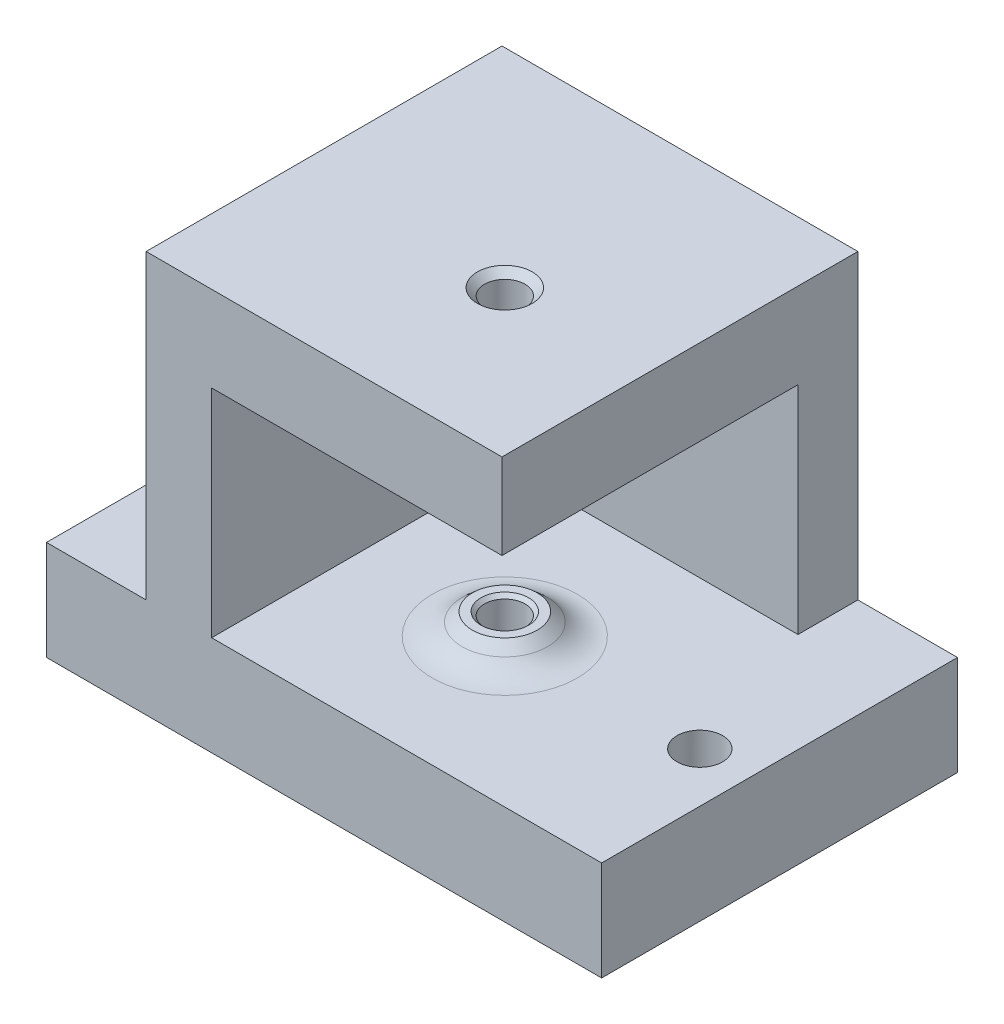
ISO-10303-21;
HEADER;
FILE_DESCRIPTION(('STEP AP214'),'2;1');
FILE_NAME('part.step','',(''),(''),'','','');
FILE_SCHEMA(('AUTOMOTIVE_DESIGN { 1 0 10303 214 1 1 1 1 }'));
ENDSEC;
DATA;
#1=APPLICATION_CONTEXT('core data for automotive mechanical design processes');
#2=APPLICATION_PROTOCOL_DEFINITION('international standard','automotive_design',2000,#1);
#3=PRODUCT_CONTEXT('',#1,'mechanical');
#4=PRODUCT('Part','Part','',(#3));
#5=PRODUCT_RELATED_PRODUCT_CATEGORY('part','',(#4));
#6=PRODUCT_DEFINITION_FORMATION('','',#4);
#7=PRODUCT_DEFINITION_CONTEXT('part definition',#1,'design');
#8=PRODUCT_DEFINITION('design','',#6,#7);
#9=PRODUCT_DEFINITION_SHAPE('','',#8);
#10=(LENGTH_UNIT() NAMED_UNIT(*) SI_UNIT(.MILLI.,.METRE.));
#11=(NAMED_UNIT(*) PLANE_ANGLE_UNIT() SI_UNIT($,.RADIAN.));
#12=(NAMED_UNIT(*) SI_UNIT($,.STERADIAN.) SOLID_ANGLE_UNIT());
#13=UNCERTAINTY_MEASURE_WITH_UNIT(LENGTH_MEASURE(1.E-05),#10,'distance_accuracy_value','');
#14=(GEOMETRIC_REPRESENTATION_CONTEXT(3) GLOBAL_UNCERTAINTY_ASSIGNED_CONTEXT((#13)) GLOBAL_UNIT_ASSIGNED_CONTEXT((#10,
#11,#12)) REPRESENTATION_CONTEXT('',''));
#15=CARTESIAN_POINT('',(0.,0.,0.));
#16=DIRECTION('',(0.,0.,1.));
#17=DIRECTION('',(1.,0.,0.));
#18=AXIS2_PLACEMENT_3D('',#15,#16,#17);
#19=CARTESIAN_POINT('',(0.,22.2,0.));
#20=DIRECTION('',(0.,1.,0.));
#21=DIRECTION('',(0.,0.,1.));
#22=AXIS2_PLACEMENT_3D('',#19,#20,#21);
#23=PLANE('',#22);
#24=CARTESIAN_POINT('',(2.30115930793886,22.2,2.10435385617415));
#25=DIRECTION('',(0.,1.,0.));
#26=DIRECTION('',(0.,0.,1.));
#27=AXIS2_PLACEMENT_3D('',#24,#25,#26);
#28=CIRCLE('',#27,5.09807621135332);
#29=CARTESIAN_POINT('',(2.30115930793886,22.2,7.20243006752747));
#30=VERTEX_POINT('',#29);
#31=EDGE_CURVE('E271',#30,#30,#28,.T.);
#32=ORIENTED_EDGE('',*,*,#31,.T.);
#33=EDGE_LOOP('',(#32));
#34=FACE_BOUND('',#33,.T.);
#35=DIRECTION('',(1.,0.,0.));
#36=VECTOR('',#35,1.);
#37=CARTESIAN_POINT('',(-12.5,22.2,12.5));
#38=LINE('',#37,#36);
#39=CARTESIAN_POINT('',(-7.89768138412228,22.2,12.5));
#40=VERTEX_POINT('',#39);
#41=CARTESIAN_POINT('',(12.5,22.2,12.5));
#42=VERTEX_POINT('',#41);
#43=EDGE_CURVE('E173',#40,#42,#38,.T.);
#44=ORIENTED_EDGE('',*,*,#43,.F.);
#45=DIRECTION('',(0.,0.,-1.));
#46=VECTOR('',#45,1.);
#47=CARTESIAN_POINT('',(-7.89768138412228,22.2,12.5));
#48=LINE('',#47,#46);
#49=CARTESIAN_POINT('',(-7.89768138412228,22.2,-8.29129228765169));
#50=VERTEX_POINT('',#49);
#51=EDGE_CURVE('E230',#40,#50,#48,.T.);
#52=ORIENTED_EDGE('',*,*,#51,.T.);
#53=DIRECTION('',(1.,0.,0.));
#54=VECTOR('',#53,1.);
#55=CARTESIAN_POINT('',(-7.89768138412228,22.2,-8.29129228765169));
#56=LINE('',#55,#54);
#57=CARTESIAN_POINT('',(12.5,22.2,-8.29129228765169));
#58=VERTEX_POINT('',#57);
#59=EDGE_CURVE('E234',#50,#58,#56,.T.);
#60=ORIENTED_EDGE('',*,*,#59,.T.);
#61=DIRECTION('',(0.,0.,-1.));
#62=VECTOR('',#61,1.);
#63=CARTESIAN_POINT('',(12.5,22.2,12.5));
#64=LINE('',#63,#62);
#65=EDGE_CURVE('E210',#42,#58,#64,.T.);
#66=ORIENTED_EDGE('',*,*,#65,.F.);
#67=EDGE_LOOP('',(#44,#52,#60,#66));
#68=FACE_BOUND('',#67,.T.);
#69=ADVANCED_FACE('F47',(#34,#68),#23,.F.);
#70=CARTESIAN_POINT('',(0.,7.,0.));
#71=DIRECTION('',(0.,-1.,0.));
#72=DIRECTION('',(0.,0.,-1.));
#73=AXIS2_PLACEMENT_3D('',#70,#71,#72);
#74=PLANE('',#73);
#75=CARTESIAN_POINT('',(2.30115930793886,7.,2.10435385617415));
#76=DIRECTION('',(0.,-1.,0.));
#77=DIRECTION('',(0.,0.,-1.));
#78=AXIS2_PLACEMENT_3D('',#75,#76,#77);
#79=CIRCLE('',#78,5.09807621135332);
#80=CARTESIAN_POINT('',(2.30115930793886,7.,-2.99372235517916));
#81=VERTEX_POINT('',#80);
#82=EDGE_CURVE('E275',#81,#81,#79,.T.);
#83=ORIENTED_EDGE('',*,*,#82,.T.);
#84=EDGE_LOOP('',(#83));
#85=FACE_BOUND('',#84,.T.);
#86=DIRECTION('',(1.,0.,0.));
#87=VECTOR('',#86,1.);
#88=CARTESIAN_POINT('',(-7.89768138412228,7.,-8.29129228765169));
#89=LINE('',#88,#87);
#90=CARTESIAN_POINT('',(-7.89768138412228,7.,-8.29129228765169));
#91=VERTEX_POINT('',#90);
#92=CARTESIAN_POINT('',(12.5,7.,-8.29129228765169));
#93=VERTEX_POINT('',#92);
#94=EDGE_CURVE('E235',#91,#93,#89,.T.);
#95=ORIENTED_EDGE('',*,*,#94,.F.);
#96=DIRECTION('',(0.,0.,-1.));
#97=VECTOR('',#96,1.);
#98=CARTESIAN_POINT('',(-7.89768138412228,7.,12.5));
#99=LINE('',#98,#97);
#100=CARTESIAN_POINT('',(-7.89768138412228,7.,12.5));
#101=VERTEX_POINT('',#100);
#102=EDGE_CURVE('E138',#101,#91,#99,.T.);
#103=ORIENTED_EDGE('',*,*,#102,.F.);
#104=DIRECTION('',(1.,0.,0.));
#105=VECTOR('',#104,1.);
#106=CARTESIAN_POINT('',(-12.5,7.,12.5));
#107=LINE('',#106,#105);
#108=CARTESIAN_POINT('',(19.5,7.,12.5));
#109=VERTEX_POINT('',#108);
#110=EDGE_CURVE('E130',#101,#109,#107,.T.);
#111=ORIENTED_EDGE('',*,*,#110,.T.);
#112=DIRECTION('',(0.,0.,1.));
#113=VECTOR('',#112,1.);
#114=CARTESIAN_POINT('',(19.5,7.,-12.5));
#115=LINE('',#114,#113);
#116=CARTESIAN_POINT('',(19.5,7.,-12.5));
#117=VERTEX_POINT('',#116);
#118=EDGE_CURVE('E135',#117,#109,#115,.T.);
#119=ORIENTED_EDGE('',*,*,#118,.F.);
#120=DIRECTION('',(1.,0.,0.));
#121=VECTOR('',#120,1.);
#122=CARTESIAN_POINT('',(12.5,7.,-12.5));
#123=LINE('',#122,#121);
#124=CARTESIAN_POINT('',(12.5,7.,-12.5));
#125=VERTEX_POINT('',#124);
#126=EDGE_CURVE('E65',#125,#117,#123,.T.);
#127=ORIENTED_EDGE('',*,*,#126,.F.);
#128=DIRECTION('',(0.,0.,-1.));
#129=VECTOR('',#128,1.);
#130=CARTESIAN_POINT('',(12.5,7.,12.5));
#131=LINE('',#130,#129);
#132=EDGE_CURVE('E11',#93,#125,#131,.T.);
#133=ORIENTED_EDGE('',*,*,#132,.F.);
#134=EDGE_LOOP('',(#95,#103,#111,#119,#127,#133));
#135=FACE_BOUND('',#134,.T.);
#136=CARTESIAN_POINT('',(16.,7.,2.10435385617415));
#137=DIRECTION('',(0.,-1.,0.));
#138=DIRECTION('',(0.,0.,-1.));
#139=AXIS2_PLACEMENT_3D('',#136,#137,#138);
#140=CIRCLE('',#139,1.60000000000001);
#141=CARTESIAN_POINT('',(16.,7.,0.504353856174149));
#142=VERTEX_POINT('',#141);
#143=EDGE_CURVE('E169',#142,#142,#140,.T.);
#144=ORIENTED_EDGE('',*,*,#143,.T.);
#145=EDGE_LOOP('',(#144));
#146=FACE_BOUND('',#145,.T.);
#147=ADVANCED_FACE('F132',(#85,#135,#146),#74,.F.);
#148=CARTESIAN_POINT('',(12.5,7.,12.5));
#149=DIRECTION('',(-1.,0.,0.));
#150=DIRECTION('',(0.,0.,1.));
#151=AXIS2_PLACEMENT_3D('',#148,#149,#150);
#152=PLANE('',#151);
#153=DIRECTION('',(0.,-1.,0.));
#154=VECTOR('',#153,1.);
#155=CARTESIAN_POINT('',(12.5,22.2,-8.29129228765169));
#156=LINE('',#155,#154);
#157=EDGE_CURVE('E239',#58,#93,#156,.T.);
#158=ORIENTED_EDGE('',*,*,#157,.T.);
#159=ORIENTED_EDGE('',*,*,#132,.T.);
#160=DIRECTION('',(0.,-1.,0.));
#161=VECTOR('',#160,1.);
#162=CARTESIAN_POINT('',(12.5,7.,-12.5));
#163=LINE('',#162,#161);
#164=CARTESIAN_POINT('',(12.5,28.2,-12.5));
#165=VERTEX_POINT('',#164);
#166=EDGE_CURVE('E267',#165,#125,#163,.T.);
#167=ORIENTED_EDGE('',*,*,#166,.F.);
#168=DIRECTION('',(0.,0.,-1.));
#169=VECTOR('',#168,1.);
#170=CARTESIAN_POINT('',(12.5,28.2,12.5));
#171=LINE('',#170,#169);
#172=CARTESIAN_POINT('',(12.5,28.2,12.5));
#173=VERTEX_POINT('',#172);
#174=EDGE_CURVE('E217',#173,#165,#171,.T.);
#175=ORIENTED_EDGE('',*,*,#174,.F.);
#176=DIRECTION('',(0.,-1.,0.));
#177=VECTOR('',#176,1.);
#178=CARTESIAN_POINT('',(12.5,28.2,12.5));
#179=LINE('',#178,#177);
#180=EDGE_CURVE('E221',#173,#42,#179,.T.);
#181=ORIENTED_EDGE('',*,*,#180,.T.);
#182=ORIENTED_EDGE('',*,*,#65,.T.);
#183=EDGE_LOOP('',(#158,#159,#167,#175,#181,#182));
#184=FACE_BOUND('',#183,.T.);
#185=ADVANCED_FACE('F351',(#184),#152,.F.);
#186=CARTESIAN_POINT('',(-12.5,7.,-12.5));
#187=DIRECTION('',(0.,0.,1.));
#188=DIRECTION('',(1.,0.,0.));
#189=AXIS2_PLACEMENT_3D('',#186,#187,#188);
#190=PLANE('',#189);
#191=DIRECTION('',(-1.,0.,0.));
#192=VECTOR('',#191,1.);
#193=CARTESIAN_POINT('',(-12.5,0.,-12.5));
#194=LINE('',#193,#192);
#195=CARTESIAN_POINT('',(19.5,0.,-12.5));
#196=VERTEX_POINT('',#195);
#197=CARTESIAN_POINT('',(-19.5,0.,-12.5));
#198=VERTEX_POINT('',#197);
#199=EDGE_CURVE('E254',#196,#198,#194,.T.);
#200=ORIENTED_EDGE('',*,*,#199,.T.);
#201=DIRECTION('',(0.,-1.,0.));
#202=VECTOR('',#201,1.);
#203=CARTESIAN_POINT('',(-19.5,32.9615099714943,-12.5));
#204=LINE('',#203,#202);
#205=CARTESIAN_POINT('',(-19.5,7.,-12.5));
#206=VERTEX_POINT('',#205);
#207=EDGE_CURVE('E193',#206,#198,#204,.T.);
#208=ORIENTED_EDGE('',*,*,#207,.F.);
#209=DIRECTION('',(1.,0.,0.));
#210=VECTOR('',#209,1.);
#211=CARTESIAN_POINT('',(-12.5,7.,-12.5));
#212=LINE('',#211,#210);
#213=CARTESIAN_POINT('',(-12.5,7.,-12.5));
#214=VERTEX_POINT('',#213);
#215=EDGE_CURVE('E178',#206,#214,#212,.T.);
#216=ORIENTED_EDGE('',*,*,#215,.T.);
#217=DIRECTION('',(0.,-1.,0.));
#218=VECTOR('',#217,1.);
#219=CARTESIAN_POINT('',(-12.5,7.,-12.5));
#220=LINE('',#219,#218);
#221=CARTESIAN_POINT('',(-12.5,28.2,-12.5));
#222=VERTEX_POINT('',#221);
#223=EDGE_CURVE('E263',#222,#214,#220,.T.);
#224=ORIENTED_EDGE('',*,*,#223,.F.);
#225=DIRECTION('',(-1.,0.,0.));
#226=VECTOR('',#225,1.);
#227=CARTESIAN_POINT('',(12.5,28.2,-12.5));
#228=LINE('',#227,#226);
#229=EDGE_CURVE('E205',#165,#222,#228,.T.);
#230=ORIENTED_EDGE('',*,*,#229,.F.);
#231=ORIENTED_EDGE('',*,*,#166,.T.);
#232=ORIENTED_EDGE('',*,*,#126,.T.);
#233=DIRECTION('',(0.,-1.,0.));
#234=VECTOR('',#233,1.);
#235=CARTESIAN_POINT('',(19.5,32.9615099714943,-12.5));
#236=LINE('',#235,#234);
#237=EDGE_CURVE('E157',#117,#196,#236,.T.);
#238=ORIENTED_EDGE('',*,*,#237,.T.);
#239=EDGE_LOOP('',(#200,#208,#216,#224,#230,#231,#232,#238));
#240=FACE_BOUND('',#239,.T.);
#241=ADVANCED_FACE('F374',(#240),#190,.F.);
#242=CARTESIAN_POINT('',(-12.5,7.,12.5));
#243=DIRECTION('',(1.,0.,0.));
#244=DIRECTION('',(0.,0.,-1.));
#245=AXIS2_PLACEMENT_3D('',#242,#243,#244);
#246=PLANE('',#245);
#247=ORIENTED_EDGE('',*,*,#223,.T.);
#248=DIRECTION('',(0.,0.,1.));
#249=VECTOR('',#248,1.);
#250=CARTESIAN_POINT('',(-12.5,7.,12.5));
#251=LINE('',#250,#249);
#252=CARTESIAN_POINT('',(-12.5,7.,12.5));
#253=VERTEX_POINT('',#252);
#254=EDGE_CURVE('E182',#214,#253,#251,.T.);
#255=ORIENTED_EDGE('',*,*,#254,.T.);
#256=DIRECTION('',(0.,-1.,0.));
#257=VECTOR('',#256,1.);
#258=CARTESIAN_POINT('',(-12.5,7.,12.5));
#259=LINE('',#258,#257);
#260=CARTESIAN_POINT('',(-12.5,28.2,12.5));
#261=VERTEX_POINT('',#260);
#262=EDGE_CURVE('E142',#261,#253,#259,.T.);
#263=ORIENTED_EDGE('',*,*,#262,.F.);
#264=DIRECTION('',(0.,0.,1.));
#265=VECTOR('',#264,1.);
#266=CARTESIAN_POINT('',(-12.5,28.2,-12.5));
#267=LINE('',#266,#265);
#268=EDGE_CURVE('E209',#222,#261,#267,.T.);
#269=ORIENTED_EDGE('',*,*,#268,.F.);
#270=EDGE_LOOP('',(#247,#255,#263,#269));
#271=FACE_BOUND('',#270,.T.);
#272=ADVANCED_FACE('F371',(#271),#246,.F.);
#273=CARTESIAN_POINT('',(-12.5,7.,12.5));
#274=DIRECTION('',(0.,0.,-1.));
#275=DIRECTION('',(-1.,0.,0.));
#276=AXIS2_PLACEMENT_3D('',#273,#274,#275);
#277=PLANE('',#276);
#278=DIRECTION('',(1.,0.,0.));
#279=VECTOR('',#278,1.);
#280=CARTESIAN_POINT('',(-12.5,0.,12.5));
#281=LINE('',#280,#279);
#282=CARTESIAN_POINT('',(-19.5,0.,12.5));
#283=VERTEX_POINT('',#282);
#284=CARTESIAN_POINT('',(19.5,0.,12.5));
#285=VERTEX_POINT('',#284);
#286=EDGE_CURVE('E143',#283,#285,#281,.T.);
#287=ORIENTED_EDGE('',*,*,#286,.T.);
#288=DIRECTION('',(0.,-1.,0.));
#289=VECTOR('',#288,1.);
#290=CARTESIAN_POINT('',(19.5,32.9615099714943,12.5));
#291=LINE('',#290,#289);
#292=EDGE_CURVE('E146',#109,#285,#291,.T.);
#293=ORIENTED_EDGE('',*,*,#292,.F.);
#294=ORIENTED_EDGE('',*,*,#110,.F.);
#295=DIRECTION('',(0.,-1.,0.));
#296=VECTOR('',#295,1.);
#297=CARTESIAN_POINT('',(-7.89768138412228,22.2,12.5));
#298=LINE('',#297,#296);
#299=EDGE_CURVE('E252',#40,#101,#298,.T.);
#300=ORIENTED_EDGE('',*,*,#299,.F.);
#301=ORIENTED_EDGE('',*,*,#43,.T.);
#302=ORIENTED_EDGE('',*,*,#180,.F.);
#303=DIRECTION('',(1.,0.,0.));
#304=VECTOR('',#303,1.);
#305=CARTESIAN_POINT('',(-12.5,28.2,12.5));
#306=LINE('',#305,#304);
#307=EDGE_CURVE('E214',#261,#173,#306,.T.);
#308=ORIENTED_EDGE('',*,*,#307,.F.);
#309=ORIENTED_EDGE('',*,*,#262,.T.);
#310=DIRECTION('',(-1.,0.,0.));
#311=VECTOR('',#310,1.);
#312=CARTESIAN_POINT('',(-19.5,7.,12.5));
#313=LINE('',#312,#311);
#314=CARTESIAN_POINT('',(-19.5,7.,12.5));
#315=VERTEX_POINT('',#314);
#316=EDGE_CURVE('E72',#253,#315,#313,.T.);
#317=ORIENTED_EDGE('',*,*,#316,.T.);
#318=DIRECTION('',(0.,-1.,0.));
#319=VECTOR('',#318,1.);
#320=CARTESIAN_POINT('',(-19.5,32.9615099714943,12.5));
#321=LINE('',#320,#319);
#322=EDGE_CURVE('E185',#315,#283,#321,.T.);
#323=ORIENTED_EDGE('',*,*,#322,.T.);
#324=EDGE_LOOP('',(#287,#293,#294,#300,#301,#302,#308,#309,#317,#323));
#325=FACE_BOUND('',#324,.T.);
#326=ADVANCED_FACE('F147',(#325),#277,.F.);
#327=CARTESIAN_POINT('',(0.,0.,0.));
#328=DIRECTION('',(0.,-1.,0.));
#329=DIRECTION('',(0.,0.,-1.));
#330=AXIS2_PLACEMENT_3D('',#327,#328,#329);
#331=PLANE('',#330);
#332=CARTESIAN_POINT('',(2.30115930793886,0.,2.10435385617415));
#333=DIRECTION('',(0.,-1.,0.));
#334=DIRECTION('',(0.,0.,-1.));
#335=AXIS2_PLACEMENT_3D('',#332,#333,#334);
#336=CIRCLE('',#335,1.925);
#337=CARTESIAN_POINT('',(2.30115930793886,0.,0.179353856174151));
#338=VERTEX_POINT('',#337);
#339=EDGE_CURVE('E318',#338,#338,#336,.F.);
#340=ORIENTED_EDGE('',*,*,#339,.T.);
#341=EDGE_LOOP('',(#340));
#342=FACE_BOUND('',#341,.T.);
#343=ORIENTED_EDGE('',*,*,#199,.F.);
#344=DIRECTION('',(0.,0.,-1.));
#345=VECTOR('',#344,1.);
#346=CARTESIAN_POINT('',(19.5,0.,-12.5));
#347=LINE('',#346,#345);
#348=EDGE_CURVE('E153',#285,#196,#347,.T.);
#349=ORIENTED_EDGE('',*,*,#348,.F.);
#350=ORIENTED_EDGE('',*,*,#286,.F.);
#351=DIRECTION('',(0.,0.,1.));
#352=VECTOR('',#351,1.);
#353=CARTESIAN_POINT('',(-19.5,0.,-12.5));
#354=LINE('',#353,#352);
#355=EDGE_CURVE('E188',#198,#283,#354,.T.);
#356=ORIENTED_EDGE('',*,*,#355,.F.);
#357=EDGE_LOOP('',(#343,#349,#350,#356));
#358=FACE_BOUND('',#357,.T.);
#359=CARTESIAN_POINT('',(-16.,0.,2.10435385617415));
#360=DIRECTION('',(0.,1.,0.));
#361=DIRECTION('',(0.,0.,-1.));
#362=AXIS2_PLACEMENT_3D('',#359,#360,#361);
#363=CIRCLE('',#362,1.60000000000001);
#364=CARTESIAN_POINT('',(-16.,0.,0.504353856174149));
#365=VERTEX_POINT('',#364);
#366=EDGE_CURVE('E163',#365,#365,#363,.T.);
#367=ORIENTED_EDGE('',*,*,#366,.T.);
#368=EDGE_LOOP('',(#367));
#369=FACE_BOUND('',#368,.T.);
#370=CARTESIAN_POINT('',(16.,0.,2.10435385617415));
#371=DIRECTION('',(0.,1.,0.));
#372=DIRECTION('',(0.,0.,1.));
#373=AXIS2_PLACEMENT_3D('',#370,#371,#372);
#374=CIRCLE('',#373,1.60000000000001);
#375=CARTESIAN_POINT('',(16.,0.,3.70435385617416));
#376=VERTEX_POINT('',#375);
#377=EDGE_CURVE('E159',#376,#376,#374,.T.);
#378=ORIENTED_EDGE('',*,*,#377,.T.);
#379=EDGE_LOOP('',(#378));
#380=FACE_BOUND('',#379,.T.);
#381=ADVANCED_FACE('F364',(#342,#358,#369,#380),#331,.T.);
#382=CARTESIAN_POINT('',(-7.89768138412228,22.2,12.5));
#383=DIRECTION('',(-1.,0.,0.));
#384=DIRECTION('',(0.,0.,1.));
#385=AXIS2_PLACEMENT_3D('',#382,#383,#384);
#386=PLANE('',#385);
#387=ORIENTED_EDGE('',*,*,#102,.T.);
#388=DIRECTION('',(0.,-1.,0.));
#389=VECTOR('',#388,1.);
#390=CARTESIAN_POINT('',(-7.89768138412228,22.2,-8.29129228765169));
#391=LINE('',#390,#389);
#392=EDGE_CURVE('E248',#50,#91,#391,.T.);
#393=ORIENTED_EDGE('',*,*,#392,.F.);
#394=ORIENTED_EDGE('',*,*,#51,.F.);
#395=ORIENTED_EDGE('',*,*,#299,.T.);
#396=EDGE_LOOP('',(#387,#393,#394,#395));
#397=FACE_BOUND('',#396,.T.);
#398=ADVANCED_FACE('F362',(#397),#386,.F.);
#399=CARTESIAN_POINT('',(-7.89768138412228,22.2,-8.29129228765169));
#400=DIRECTION('',(0.,0.,-1.));
#401=DIRECTION('',(-1.,0.,0.));
#402=AXIS2_PLACEMENT_3D('',#399,#400,#401);
#403=PLANE('',#402);
#404=ORIENTED_EDGE('',*,*,#94,.T.);
#405=ORIENTED_EDGE('',*,*,#157,.F.);
#406=ORIENTED_EDGE('',*,*,#59,.F.);
#407=ORIENTED_EDGE('',*,*,#392,.T.);
#408=EDGE_LOOP('',(#404,#405,#406,#407));
#409=FACE_BOUND('',#408,.T.);
#410=ADVANCED_FACE('F359',(#409),#403,.F.);
#411=CARTESIAN_POINT('',(0.,28.2,0.));
#412=DIRECTION('',(0.,1.,0.));
#413=DIRECTION('',(0.,0.,1.));
#414=AXIS2_PLACEMENT_3D('',#411,#412,#413);
#415=PLANE('',#414);
#416=CARTESIAN_POINT('',(2.30115930793886,28.2,2.10435385617415));
#417=DIRECTION('',(0.,1.,0.));
#418=DIRECTION('',(0.,0.,1.));
#419=AXIS2_PLACEMENT_3D('',#416,#417,#418);
#420=CIRCLE('',#419,1.925);
#421=CARTESIAN_POINT('',(2.30115930793886,28.2,4.02935385617415));
#422=VERTEX_POINT('',#421);
#423=EDGE_CURVE('E315',#422,#422,#420,.F.);
#424=ORIENTED_EDGE('',*,*,#423,.T.);
#425=EDGE_LOOP('',(#424));
#426=FACE_BOUND('',#425,.T.);
#427=ORIENTED_EDGE('',*,*,#229,.T.);
#428=ORIENTED_EDGE('',*,*,#268,.T.);
#429=ORIENTED_EDGE('',*,*,#307,.T.);
#430=ORIENTED_EDGE('',*,*,#174,.T.);
#431=EDGE_LOOP('',(#427,#428,#429,#430));
#432=FACE_BOUND('',#431,.T.);
#433=ADVANCED_FACE('F357',(#426,#432),#415,.T.);
#434=CARTESIAN_POINT('',(2.30115930793886,0.,2.10435385617415));
#435=DIRECTION('',(0.,1.,0.));
#436=DIRECTION('',(0.,0.,1.));
#437=AXIS2_PLACEMENT_3D('',#434,#435,#436);
#438=CYLINDRICAL_SURFACE('',#437,1.425);
#439=CARTESIAN_POINT('',(2.30115930793886,27.7,2.10435385617415));
#440=DIRECTION('',(0.,1.,0.));
#441=DIRECTION('',(0.,0.,1.));
#442=AXIS2_PLACEMENT_3D('',#439,#440,#441);
#443=CIRCLE('',#442,1.425);
#444=CARTESIAN_POINT('',(2.30115930793886,27.7,3.52935385617415));
#445=VERTEX_POINT('',#444);
#446=EDGE_CURVE('E311',#445,#445,#443,.T.);
#447=ORIENTED_EDGE('',*,*,#446,.T.);
#448=EDGE_LOOP('',(#447));
#449=FACE_BOUND('',#448,.T.);
#450=CARTESIAN_POINT('',(2.30115930793886,20.95,2.10435385617415));
#451=DIRECTION('',(0.,-1.,0.));
#452=DIRECTION('',(0.,0.,-1.));
#453=AXIS2_PLACEMENT_3D('',#450,#451,#452);
#454=CIRCLE('',#453,1.425);
#455=CARTESIAN_POINT('',(2.30115930793886,20.95,0.679353856174154));
#456=VERTEX_POINT('',#455);
#457=EDGE_CURVE('E303',#456,#456,#454,.T.);
#458=ORIENTED_EDGE('',*,*,#457,.T.);
#459=EDGE_LOOP('',(#458));
#460=FACE_BOUND('',#459,.T.);
#461=ADVANCED_FACE('F428',(#449,#460),#438,.F.);
#462=CARTESIAN_POINT('',(2.30115930793886,0.500000000000005,2.10435385617415));
#463=DIRECTION('',(0.,-1.,0.));
#464=DIRECTION('',(0.,0.,-1.));
#465=AXIS2_PLACEMENT_3D('',#462,#463,#464);
#466=CIRCLE('',#465,1.425);
#467=CARTESIAN_POINT('',(2.30115930793886,0.500000000000005,0.679353856174154));
#468=VERTEX_POINT('',#467);
#469=EDGE_CURVE('E52',#468,#468,#466,.T.);
#470=ORIENTED_EDGE('',*,*,#469,.T.);
#471=EDGE_LOOP('',(#470));
#472=FACE_BOUND('',#471,.T.);
#473=CARTESIAN_POINT('',(2.30115930793886,8.25000000000001,2.10435385617415));
#474=DIRECTION('',(0.,1.,0.));
#475=DIRECTION('',(0.,0.,1.));
#476=AXIS2_PLACEMENT_3D('',#473,#474,#475);
#477=CIRCLE('',#476,1.425);
#478=CARTESIAN_POINT('',(2.30115930793886,8.25000000000001,3.52935385617415));
#479=VERTEX_POINT('',#478);
#480=EDGE_CURVE('E295',#479,#479,#477,.T.);
#481=ORIENTED_EDGE('',*,*,#480,.T.);
#482=EDGE_LOOP('',(#481));
#483=FACE_BOUND('',#482,.T.);
#484=ADVANCED_FACE('F327',(#472,#483),#438,.F.);
#485=CARTESIAN_POINT('',(2.30115930793886,8.5,2.10435385617415));
#486=DIRECTION('',(0.,1.,0.));
#487=DIRECTION('',(0.,0.,1.));
#488=AXIS2_PLACEMENT_3D('',#485,#486,#487);
#489=PLANE('',#488);
#490=CARTESIAN_POINT('',(2.30115930793886,8.5,2.10435385617415));
#491=DIRECTION('',(0.,1.,0.));
#492=DIRECTION('',(0.,0.,1.));
#493=AXIS2_PLACEMENT_3D('',#490,#491,#492);
#494=CIRCLE('',#493,1.67499999999999);
#495=CARTESIAN_POINT('',(2.30115930793886,8.5,3.77935385617414));
#496=VERTEX_POINT('',#495);
#497=EDGE_CURVE('E299',#496,#496,#494,.F.);
#498=ORIENTED_EDGE('',*,*,#497,.T.);
#499=EDGE_LOOP('',(#498));
#500=FACE_BOUND('',#499,.T.);
#501=CARTESIAN_POINT('',(2.30115930793886,8.5,2.10435385617415));
#502=DIRECTION('',(0.,1.,0.));
#503=DIRECTION('',(0.,0.,1.));
#504=AXIS2_PLACEMENT_3D('',#501,#502,#503);
#505=CIRCLE('',#504,2.27508897871177);
#506=CARTESIAN_POINT('',(2.30115930793886,8.5,4.37944283488592));
#507=VERTEX_POINT('',#506);
#508=EDGE_CURVE('E287',#507,#507,#505,.T.);
#509=ORIENTED_EDGE('',*,*,#508,.T.);
#510=EDGE_LOOP('',(#509));
#511=FACE_BOUND('',#510,.T.);
#512=ADVANCED_FACE('F434',(#500,#511),#489,.T.);
#513=CARTESIAN_POINT('',(2.30115930793886,20.7,2.10435385617415));
#514=DIRECTION('',(0.,-1.,0.));
#515=DIRECTION('',(0.,0.,-1.));
#516=AXIS2_PLACEMENT_3D('',#513,#514,#515);
#517=PLANE('',#516);
#518=CARTESIAN_POINT('',(2.30115930793886,20.7,2.10435385617415));
#519=DIRECTION('',(0.,-1.,0.));
#520=DIRECTION('',(0.,0.,-1.));
#521=AXIS2_PLACEMENT_3D('',#518,#519,#520);
#522=CIRCLE('',#521,1.675);
#523=CARTESIAN_POINT('',(2.30115930793886,20.7,0.429353856174151));
#524=VERTEX_POINT('',#523);
#525=EDGE_CURVE('E307',#524,#524,#522,.F.);
#526=ORIENTED_EDGE('',*,*,#525,.T.);
#527=EDGE_LOOP('',(#526));
#528=FACE_BOUND('',#527,.T.);
#529=CARTESIAN_POINT('',(2.30115930793886,20.7,2.10435385617415));
#530=DIRECTION('',(0.,-1.,0.));
#531=DIRECTION('',(0.,0.,-1.));
#532=AXIS2_PLACEMENT_3D('',#529,#530,#531);
#533=CIRCLE('',#532,2.27508897871176);
#534=CARTESIAN_POINT('',(2.30115930793886,20.7,-0.17073512253761));
#535=VERTEX_POINT('',#534);
#536=EDGE_CURVE('E279',#535,#535,#533,.T.);
#537=ORIENTED_EDGE('',*,*,#536,.T.);
#538=EDGE_LOOP('',(#537));
#539=FACE_BOUND('',#538,.T.);
#540=ADVANCED_FACE('F385',(#528,#539),#517,.T.);
#541=CARTESIAN_POINT('',(2.30115930793886,19.2,2.10435385617415));
#542=DIRECTION('',(0.,1.,0.));
#543=DIRECTION('',(0.,0.,1.));
#544=AXIS2_PLACEMENT_3D('',#541,#542,#543);
#545=TOROIDAL_SURFACE('',#544,5.09807621135332,3.);
#546=CARTESIAN_POINT('',(2.30115930793886,21.343800444882,2.10435385617415));
#547=DIRECTION('',(0.,-1.,0.));
#548=DIRECTION('',(0.,0.,-1.));
#549=AXIS2_PLACEMENT_3D('',#546,#547,#548);
#550=CIRCLE('',#549,2.99947676111905);
#551=CARTESIAN_POINT('',(2.30115930793886,21.343800444882,-0.895122904944892));
#552=VERTEX_POINT('',#551);
#553=EDGE_CURVE('E283',#552,#552,#550,.F.);
#554=ORIENTED_EDGE('',*,*,#553,.T.);
#555=EDGE_LOOP('',(#554));
#556=FACE_BOUND('',#555,.T.);
#557=ORIENTED_EDGE('',*,*,#31,.F.);
#558=EDGE_LOOP('',(#557));
#559=FACE_BOUND('',#558,.T.);
#560=ADVANCED_FACE('F382',(#556,#559),#545,.F.);
#561=CARTESIAN_POINT('',(2.30115930793886,10.,2.10435385617415));
#562=DIRECTION('',(0.,-1.,0.));
#563=DIRECTION('',(0.,0.,-1.));
#564=AXIS2_PLACEMENT_3D('',#561,#562,#563);
#565=TOROIDAL_SURFACE('',#564,5.09807621135332,3.);
#566=CARTESIAN_POINT('',(2.30115930793886,7.85619955511796,2.10435385617415));
#567=DIRECTION('',(0.,1.,0.));
#568=DIRECTION('',(0.,0.,1.));
#569=AXIS2_PLACEMENT_3D('',#566,#567,#568);
#570=CIRCLE('',#569,2.99947676111905);
#571=CARTESIAN_POINT('',(2.30115930793886,7.85619955511796,5.1038306172932));
#572=VERTEX_POINT('',#571);
#573=EDGE_CURVE('E291',#572,#572,#570,.F.);
#574=ORIENTED_EDGE('',*,*,#573,.T.);
#575=EDGE_LOOP('',(#574));
#576=FACE_BOUND('',#575,.T.);
#577=ORIENTED_EDGE('',*,*,#82,.F.);
#578=EDGE_LOOP('',(#577));
#579=FACE_BOUND('',#578,.T.);
#580=ADVANCED_FACE('F384',(#576,#579),#565,.F.);
#581=CARTESIAN_POINT('',(2.30115930793886,20.7,2.10435385617415));
#582=DIRECTION('',(0.,1.,0.));
#583=DIRECTION('',(0.,0.,1.));
#584=AXIS2_PLACEMENT_3D('',#581,#582,#583);
#585=CONICAL_SURFACE('',#584,2.27508897871176,0.844230958136128);
#586=ORIENTED_EDGE('',*,*,#553,.F.);
#587=EDGE_LOOP('',(#586));
#588=FACE_BOUND('',#587,.T.);
#589=ORIENTED_EDGE('',*,*,#536,.F.);
#590=EDGE_LOOP('',(#589));
#591=FACE_BOUND('',#590,.T.);
#592=ADVANCED_FACE('F389',(#588,#591),#585,.T.);
#593=CARTESIAN_POINT('',(2.30115930793886,8.5,2.10435385617415));
#594=DIRECTION('',(0.,-1.,0.));
#595=DIRECTION('',(0.,0.,-1.));
#596=AXIS2_PLACEMENT_3D('',#593,#594,#595);
#597=CONICAL_SURFACE('',#596,2.27508897871177,0.844230958136128);
#598=ORIENTED_EDGE('',*,*,#573,.F.);
#599=EDGE_LOOP('',(#598));
#600=FACE_BOUND('',#599,.T.);
#601=ORIENTED_EDGE('',*,*,#508,.F.);
#602=EDGE_LOOP('',(#601));
#603=FACE_BOUND('',#602,.T.);
#604=ADVANCED_FACE('F397',(#600,#603),#597,.T.);
#605=CARTESIAN_POINT('',(2.30115930793886,8.25000000000001,2.10435385617415));
#606=DIRECTION('',(0.,1.,0.));
#607=DIRECTION('',(0.,0.,1.));
#608=AXIS2_PLACEMENT_3D('',#605,#606,#607);
#609=CONICAL_SURFACE('',#608,1.425,0.785398163397447);
#610=ORIENTED_EDGE('',*,*,#497,.F.);
#611=EDGE_LOOP('',(#610));
#612=FACE_BOUND('',#611,.T.);
#613=ORIENTED_EDGE('',*,*,#480,.F.);
#614=EDGE_LOOP('',(#613));
#615=FACE_BOUND('',#614,.T.);
#616=ADVANCED_FACE('F404',(#612,#615),#609,.F.);
#617=CARTESIAN_POINT('',(2.30115930793886,20.95,2.10435385617415));
#618=DIRECTION('',(0.,-1.,0.));
#619=DIRECTION('',(0.,0.,-1.));
#620=AXIS2_PLACEMENT_3D('',#617,#618,#619);
#621=CONICAL_SURFACE('',#620,1.425,0.785398163397447);
#622=ORIENTED_EDGE('',*,*,#525,.F.);
#623=EDGE_LOOP('',(#622));
#624=FACE_BOUND('',#623,.T.);
#625=ORIENTED_EDGE('',*,*,#457,.F.);
#626=EDGE_LOOP('',(#625));
#627=FACE_BOUND('',#626,.T.);
#628=ADVANCED_FACE('F342',(#624,#627),#621,.F.);
#629=CARTESIAN_POINT('',(2.30115930793886,27.7,2.10435385617415));
#630=DIRECTION('',(0.,1.,0.));
#631=DIRECTION('',(0.,0.,1.));
#632=AXIS2_PLACEMENT_3D('',#629,#630,#631);
#633=CONICAL_SURFACE('',#632,1.425,0.785398163397448);
#634=ORIENTED_EDGE('',*,*,#423,.F.);
#635=EDGE_LOOP('',(#634));
#636=FACE_BOUND('',#635,.T.);
#637=ORIENTED_EDGE('',*,*,#446,.F.);
#638=EDGE_LOOP('',(#637));
#639=FACE_BOUND('',#638,.T.);
#640=ADVANCED_FACE('F333',(#636,#639),#633,.F.);
#641=CARTESIAN_POINT('',(2.30115930793886,0.,2.10435385617415));
#642=DIRECTION('',(0.,-1.,0.));
#643=DIRECTION('',(0.,0.,-1.));
#644=AXIS2_PLACEMENT_3D('',#641,#642,#643);
#645=CONICAL_SURFACE('',#644,1.925,0.785398163397446);
#646=ORIENTED_EDGE('',*,*,#469,.F.);
#647=EDGE_LOOP('',(#646));
#648=FACE_BOUND('',#647,.T.);
#649=ORIENTED_EDGE('',*,*,#339,.F.);
#650=EDGE_LOOP('',(#649));
#651=FACE_BOUND('',#650,.T.);
#652=ADVANCED_FACE('F50',(#648,#651),#645,.F.);
#653=CARTESIAN_POINT('',(-19.5,32.9615099714943,-12.5));
#654=DIRECTION('',(1.,0.,0.));
#655=DIRECTION('',(0.,0.,-1.));
#656=AXIS2_PLACEMENT_3D('',#653,#654,#655);
#657=PLANE('',#656);
#658=ORIENTED_EDGE('',*,*,#322,.F.);
#659=DIRECTION('',(0.,0.,-1.));
#660=VECTOR('',#659,1.);
#661=CARTESIAN_POINT('',(-19.5,7.,-12.5));
#662=LINE('',#661,#660);
#663=EDGE_CURVE('E189',#315,#206,#662,.T.);
#664=ORIENTED_EDGE('',*,*,#663,.T.);
#665=ORIENTED_EDGE('',*,*,#207,.T.);
#666=ORIENTED_EDGE('',*,*,#355,.T.);
#667=EDGE_LOOP('',(#658,#664,#665,#666));
#668=FACE_BOUND('',#667,.T.);
#669=ADVANCED_FACE('F332',(#668),#657,.F.);
#670=CARTESIAN_POINT('',(-16.,32.9615099714943,2.10435385617415));
#671=DIRECTION('',(0.,-1.,0.));
#672=DIRECTION('',(0.,0.,-1.));
#673=AXIS2_PLACEMENT_3D('',#670,#671,#672);
#674=CYLINDRICAL_SURFACE('',#673,1.60000000000001);
#675=CARTESIAN_POINT('',(-16.,7.,2.10435385617415));
#676=DIRECTION('',(0.,-1.,0.));
#677=DIRECTION('',(0.,0.,-1.));
#678=AXIS2_PLACEMENT_3D('',#675,#676,#677);
#679=CIRCLE('',#678,1.60000000000001);
#680=CARTESIAN_POINT('',(-16.,7.,0.504353856174149));
#681=VERTEX_POINT('',#680);
#682=EDGE_CURVE('E174',#681,#681,#679,.T.);
#683=ORIENTED_EDGE('',*,*,#682,.F.);
#684=EDGE_LOOP('',(#683));
#685=FACE_BOUND('',#684,.T.);
#686=ORIENTED_EDGE('',*,*,#366,.F.);
#687=EDGE_LOOP('',(#686));
#688=FACE_BOUND('',#687,.T.);
#689=ADVANCED_FACE('F339',(#685,#688),#674,.F.);
#690=CARTESIAN_POINT('',(0.,7.,0.));
#691=DIRECTION('',(0.,-1.,0.));
#692=DIRECTION('',(0.,0.,-1.));
#693=AXIS2_PLACEMENT_3D('',#690,#691,#692);
#694=PLANE('',#693);
#695=ORIENTED_EDGE('',*,*,#682,.T.);
#696=EDGE_LOOP('',(#695));
#697=FACE_BOUND('',#696,.T.);
#698=ORIENTED_EDGE('',*,*,#316,.F.);
#699=ORIENTED_EDGE('',*,*,#254,.F.);
#700=ORIENTED_EDGE('',*,*,#215,.F.);
#701=ORIENTED_EDGE('',*,*,#663,.F.);
#702=EDGE_LOOP('',(#698,#699,#700,#701));
#703=FACE_BOUND('',#702,.T.);
#704=ADVANCED_FACE('F445',(#697,#703),#694,.F.);
#705=CARTESIAN_POINT('',(19.5,32.9615099714943,-12.5));
#706=DIRECTION('',(-1.,0.,0.));
#707=DIRECTION('',(0.,0.,1.));
#708=AXIS2_PLACEMENT_3D('',#705,#706,#707);
#709=PLANE('',#708);
#710=ORIENTED_EDGE('',*,*,#237,.F.);
#711=ORIENTED_EDGE('',*,*,#118,.T.);
#712=ORIENTED_EDGE('',*,*,#292,.T.);
#713=ORIENTED_EDGE('',*,*,#348,.T.);
#714=EDGE_LOOP('',(#710,#711,#712,#713));
#715=FACE_BOUND('',#714,.T.);
#716=ADVANCED_FACE('F155',(#715),#709,.F.);
#717=CARTESIAN_POINT('',(16.,32.9615099714943,2.10435385617415));
#718=DIRECTION('',(0.,-1.,0.));
#719=DIRECTION('',(0.,0.,-1.));
#720=AXIS2_PLACEMENT_3D('',#717,#718,#719);
#721=CYLINDRICAL_SURFACE('',#720,1.60000000000001);
#722=ORIENTED_EDGE('',*,*,#143,.F.);
#723=EDGE_LOOP('',(#722));
#724=FACE_BOUND('',#723,.T.);
#725=ORIENTED_EDGE('',*,*,#377,.F.);
#726=EDGE_LOOP('',(#725));
#727=FACE_BOUND('',#726,.T.);
#728=ADVANCED_FACE('F450',(#724,#727),#721,.F.);
#729=CLOSED_SHELL('',(#69,#147,#185,#241,#272,#326,#381,#398,#410,#433,#461,#484,#512,#540,#560,
#580,#592,#604,#616,#628,#640,#652,#669,#689,#704,#716,#728));
#730=MANIFOLD_SOLID_BREP('B2',#729);
#731=ADVANCED_BREP_SHAPE_REPRESENTATION('',(#18,#730),#14);
#732=SHAPE_DEFINITION_REPRESENTATION(#9,#731);
ENDSEC;
END-ISO-10303-21;
